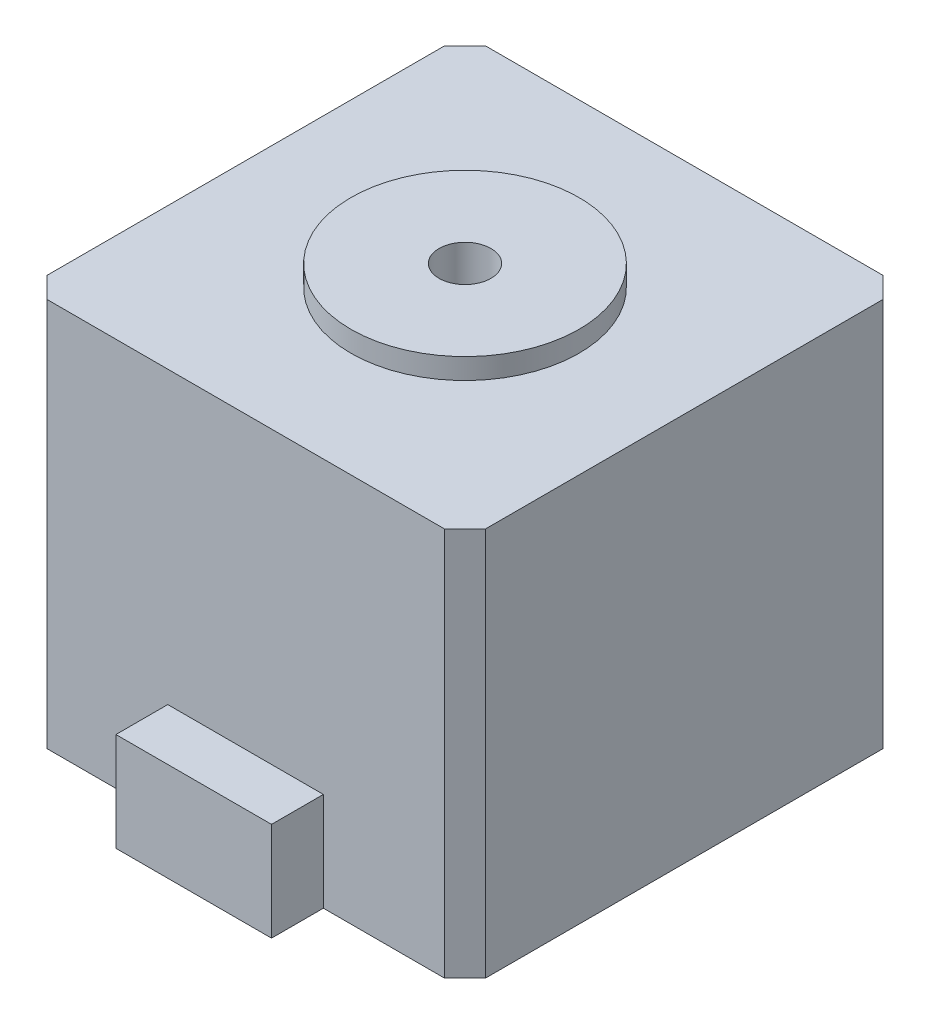
ISO-10303-21;
HEADER;
FILE_DESCRIPTION(('STEP AP214'),'2;1');
FILE_NAME('part.step','',(''),(''),'','','');
FILE_SCHEMA(('AUTOMOTIVE_DESIGN { 1 0 10303 214 1 1 1 1 }'));
ENDSEC;
DATA;
#1=APPLICATION_CONTEXT('core data for automotive mechanical design processes');
#2=APPLICATION_PROTOCOL_DEFINITION('international standard','automotive_design',2000,#1);
#3=PRODUCT_CONTEXT('',#1,'mechanical');
#4=PRODUCT('Part','Part','',(#3));
#5=PRODUCT_RELATED_PRODUCT_CATEGORY('part','',(#4));
#6=PRODUCT_DEFINITION_FORMATION('','',#4);
#7=PRODUCT_DEFINITION_CONTEXT('part definition',#1,'design');
#8=PRODUCT_DEFINITION('design','',#6,#7);
#9=PRODUCT_DEFINITION_SHAPE('','',#8);
#10=(LENGTH_UNIT() NAMED_UNIT(*) SI_UNIT(.MILLI.,.METRE.));
#11=(NAMED_UNIT(*) PLANE_ANGLE_UNIT() SI_UNIT($,.RADIAN.));
#12=(NAMED_UNIT(*) SI_UNIT($,.STERADIAN.) SOLID_ANGLE_UNIT());
#13=UNCERTAINTY_MEASURE_WITH_UNIT(LENGTH_MEASURE(1.E-05),#10,'distance_accuracy_value','');
#14=(GEOMETRIC_REPRESENTATION_CONTEXT(3) GLOBAL_UNCERTAINTY_ASSIGNED_CONTEXT((#13)) GLOBAL_UNIT_ASSIGNED_CONTEXT((#10,
#11,#12)) REPRESENTATION_CONTEXT('',''));
#15=CARTESIAN_POINT('',(0.,0.,0.));
#16=DIRECTION('',(0.,0.,1.));
#17=DIRECTION('',(1.,0.,0.));
#18=AXIS2_PLACEMENT_3D('',#15,#16,#17);
#19=CARTESIAN_POINT('',(0.,37.5,0.));
#20=DIRECTION('',(0.,0.,-1.));
#21=DIRECTION('',(-1.,0.,0.));
#22=AXIS2_PLACEMENT_3D('',#19,#20,#21);
#23=PLANE('',#22);
#24=DIRECTION('',(0.,-1.,0.));
#25=VECTOR('',#24,1.);
#26=CARTESIAN_POINT('',(13.65,0.,0.));
#27=LINE('',#26,#25);
#28=CARTESIAN_POINT('',(13.65,9.5,0.));
#29=VERTEX_POINT('',#28);
#30=CARTESIAN_POINT('',(13.65,0.,0.));
#31=VERTEX_POINT('',#30);
#32=EDGE_CURVE('E65',#29,#31,#27,.T.);
#33=ORIENTED_EDGE('',*,*,#32,.F.);
#34=DIRECTION('',(-1.,0.,0.));
#35=VECTOR('',#34,1.);
#36=CARTESIAN_POINT('',(13.65,9.5,0.));
#37=LINE('',#36,#35);
#38=CARTESIAN_POINT('',(28.65,9.5,0.));
#39=VERTEX_POINT('',#38);
#40=EDGE_CURVE('E161',#39,#29,#37,.T.);
#41=ORIENTED_EDGE('',*,*,#40,.F.);
#42=DIRECTION('',(0.,1.,0.));
#43=VECTOR('',#42,1.);
#44=CARTESIAN_POINT('',(28.65,0.,0.));
#45=LINE('',#44,#43);
#46=CARTESIAN_POINT('',(28.65,0.,0.));
#47=VERTEX_POINT('',#46);
#48=EDGE_CURVE('E71',#47,#39,#45,.T.);
#49=ORIENTED_EDGE('',*,*,#48,.F.);
#50=DIRECTION('',(1.,0.,0.));
#51=VECTOR('',#50,1.);
#52=CARTESIAN_POINT('',(0.,0.,0.));
#53=LINE('',#52,#51);
#54=CARTESIAN_POINT('',(40.3,0.,0.));
#55=VERTEX_POINT('',#54);
#56=EDGE_CURVE('E205',#47,#55,#53,.T.);
#57=ORIENTED_EDGE('',*,*,#56,.T.);
#58=DIRECTION('',(0.,1.,0.));
#59=VECTOR('',#58,1.);
#60=CARTESIAN_POINT('',(40.3,37.5,0.));
#61=LINE('',#60,#59);
#62=CARTESIAN_POINT('',(40.3,37.5,0.));
#63=VERTEX_POINT('',#62);
#64=EDGE_CURVE('E260',#55,#63,#61,.T.);
#65=ORIENTED_EDGE('',*,*,#64,.T.);
#66=DIRECTION('',(1.,0.,0.));
#67=VECTOR('',#66,1.);
#68=CARTESIAN_POINT('',(0.,37.5,0.));
#69=LINE('',#68,#67);
#70=CARTESIAN_POINT('',(2.,37.5,0.));
#71=VERTEX_POINT('',#70);
#72=EDGE_CURVE('E188',#71,#63,#69,.T.);
#73=ORIENTED_EDGE('',*,*,#72,.F.);
#74=DIRECTION('',(0.,-1.,0.));
#75=VECTOR('',#74,1.);
#76=CARTESIAN_POINT('',(2.,37.5,0.));
#77=LINE('',#76,#75);
#78=CARTESIAN_POINT('',(2.,0.,0.));
#79=VERTEX_POINT('',#78);
#80=EDGE_CURVE('E52',#71,#79,#77,.T.);
#81=ORIENTED_EDGE('',*,*,#80,.T.);
#82=EDGE_CURVE('E206',#79,#31,#53,.T.);
#83=ORIENTED_EDGE('',*,*,#82,.T.);
#84=EDGE_LOOP('',(#33,#41,#49,#57,#65,#73,#81,#83));
#85=FACE_BOUND('',#84,.T.);
#86=ADVANCED_FACE('F47',(#85),#23,.F.);
#87=CARTESIAN_POINT('',(0.,37.5,0.));
#88=DIRECTION('',(1.,0.,0.));
#89=DIRECTION('',(0.,0.,-1.));
#90=AXIS2_PLACEMENT_3D('',#87,#88,#89);
#91=PLANE('',#90);
#92=DIRECTION('',(0.,0.,1.));
#93=VECTOR('',#92,1.);
#94=CARTESIAN_POINT('',(0.,37.5,0.));
#95=LINE('',#94,#93);
#96=CARTESIAN_POINT('',(0.,37.5,-40.3));
#97=VERTEX_POINT('',#96);
#98=CARTESIAN_POINT('',(0.,37.5,-2.));
#99=VERTEX_POINT('',#98);
#100=EDGE_CURVE('E184',#97,#99,#95,.T.);
#101=ORIENTED_EDGE('',*,*,#100,.F.);
#102=DIRECTION('',(0.,-1.,0.));
#103=VECTOR('',#102,1.);
#104=CARTESIAN_POINT('',(0.,37.5,-40.3));
#105=LINE('',#104,#103);
#106=CARTESIAN_POINT('',(0.,0.,-40.3));
#107=VERTEX_POINT('',#106);
#108=EDGE_CURVE('E257',#97,#107,#105,.T.);
#109=ORIENTED_EDGE('',*,*,#108,.T.);
#110=DIRECTION('',(0.,0.,1.));
#111=VECTOR('',#110,1.);
#112=CARTESIAN_POINT('',(0.,0.,0.));
#113=LINE('',#112,#111);
#114=CARTESIAN_POINT('',(0.,0.,-2.));
#115=VERTEX_POINT('',#114);
#116=EDGE_CURVE('E182',#107,#115,#113,.T.);
#117=ORIENTED_EDGE('',*,*,#116,.T.);
#118=DIRECTION('',(0.,1.,0.));
#119=VECTOR('',#118,1.);
#120=CARTESIAN_POINT('',(0.,37.5,-2.));
#121=LINE('',#120,#119);
#122=EDGE_CURVE('E254',#115,#99,#121,.T.);
#123=ORIENTED_EDGE('',*,*,#122,.T.);
#124=EDGE_LOOP('',(#101,#109,#117,#123));
#125=FACE_BOUND('',#124,.T.);
#126=ADVANCED_FACE('F273',(#125),#91,.F.);
#127=CARTESIAN_POINT('',(42.3,37.5,0.));
#128=DIRECTION('',(-1.,0.,0.));
#129=DIRECTION('',(0.,0.,1.));
#130=AXIS2_PLACEMENT_3D('',#127,#128,#129);
#131=PLANE('',#130);
#132=DIRECTION('',(0.,0.,-1.));
#133=VECTOR('',#132,1.);
#134=CARTESIAN_POINT('',(42.3,0.,0.));
#135=LINE('',#134,#133);
#136=CARTESIAN_POINT('',(42.3,0.,-2.));
#137=VERTEX_POINT('',#136);
#138=CARTESIAN_POINT('',(42.3,0.,-40.3));
#139=VERTEX_POINT('',#138);
#140=EDGE_CURVE('E209',#137,#139,#135,.T.);
#141=ORIENTED_EDGE('',*,*,#140,.T.);
#142=DIRECTION('',(0.,1.,0.));
#143=VECTOR('',#142,1.);
#144=CARTESIAN_POINT('',(42.3,37.5,-40.3));
#145=LINE('',#144,#143);
#146=CARTESIAN_POINT('',(42.3,37.5,-40.3));
#147=VERTEX_POINT('',#146);
#148=EDGE_CURVE('E239',#139,#147,#145,.T.);
#149=ORIENTED_EDGE('',*,*,#148,.T.);
#150=DIRECTION('',(0.,0.,-1.));
#151=VECTOR('',#150,1.);
#152=CARTESIAN_POINT('',(42.3,37.5,0.));
#153=LINE('',#152,#151);
#154=CARTESIAN_POINT('',(42.3,37.5,-2.));
#155=VERTEX_POINT('',#154);
#156=EDGE_CURVE('E193',#155,#147,#153,.T.);
#157=ORIENTED_EDGE('',*,*,#156,.F.);
#158=DIRECTION('',(0.,-1.,0.));
#159=VECTOR('',#158,1.);
#160=CARTESIAN_POINT('',(42.3,37.5,-2.));
#161=LINE('',#160,#159);
#162=EDGE_CURVE('E235',#155,#137,#161,.T.);
#163=ORIENTED_EDGE('',*,*,#162,.T.);
#164=EDGE_LOOP('',(#141,#149,#157,#163));
#165=FACE_BOUND('',#164,.T.);
#166=ADVANCED_FACE('F293',(#165),#131,.F.);
#167=CARTESIAN_POINT('',(0.,37.5,-42.3));
#168=DIRECTION('',(0.,0.,1.));
#169=DIRECTION('',(1.,0.,0.));
#170=AXIS2_PLACEMENT_3D('',#167,#168,#169);
#171=PLANE('',#170);
#172=DIRECTION('',(-1.,0.,0.));
#173=VECTOR('',#172,1.);
#174=CARTESIAN_POINT('',(0.,37.5,-42.3));
#175=LINE('',#174,#173);
#176=CARTESIAN_POINT('',(40.3,37.5,-42.3));
#177=VERTEX_POINT('',#176);
#178=CARTESIAN_POINT('',(2.00000000000001,37.5,-42.3));
#179=VERTEX_POINT('',#178);
#180=EDGE_CURVE('E197',#177,#179,#175,.T.);
#181=ORIENTED_EDGE('',*,*,#180,.F.);
#182=DIRECTION('',(0.,-1.,0.));
#183=VECTOR('',#182,1.);
#184=CARTESIAN_POINT('',(40.3,37.5,-42.3));
#185=LINE('',#184,#183);
#186=CARTESIAN_POINT('',(40.3,0.,-42.3));
#187=VERTEX_POINT('',#186);
#188=EDGE_CURVE('E218',#177,#187,#185,.T.);
#189=ORIENTED_EDGE('',*,*,#188,.T.);
#190=DIRECTION('',(-1.,0.,0.));
#191=VECTOR('',#190,1.);
#192=CARTESIAN_POINT('',(0.,0.,-42.3));
#193=LINE('',#192,#191);
#194=CARTESIAN_POINT('',(2.00000000000001,0.,-42.3));
#195=VERTEX_POINT('',#194);
#196=EDGE_CURVE('E189',#187,#195,#193,.T.);
#197=ORIENTED_EDGE('',*,*,#196,.T.);
#198=DIRECTION('',(0.,1.,0.));
#199=VECTOR('',#198,1.);
#200=CARTESIAN_POINT('',(2.00000000000002,37.5,-42.3));
#201=LINE('',#200,#199);
#202=EDGE_CURVE('E201',#195,#179,#201,.T.);
#203=ORIENTED_EDGE('',*,*,#202,.T.);
#204=EDGE_LOOP('',(#181,#189,#197,#203));
#205=FACE_BOUND('',#204,.T.);
#206=ADVANCED_FACE('F285',(#205),#171,.F.);
#207=CARTESIAN_POINT('',(0.,37.5,0.));
#208=DIRECTION('',(0.,-1.,0.));
#209=DIRECTION('',(0.,0.,-1.));
#210=AXIS2_PLACEMENT_3D('',#207,#208,#209);
#211=PLANE('',#210);
#212=CARTESIAN_POINT('',(21.15,37.5,-21.15));
#213=DIRECTION('',(0.,1.,0.));
#214=DIRECTION('',(0.,0.,1.));
#215=AXIS2_PLACEMENT_3D('',#212,#213,#214);
#216=CIRCLE('',#215,11.);
#217=CARTESIAN_POINT('',(21.15,37.5,-10.15));
#218=VERTEX_POINT('',#217);
#219=EDGE_CURVE('E11',#218,#218,#216,.T.);
#220=ORIENTED_EDGE('',*,*,#219,.F.);
#221=EDGE_LOOP('',(#220));
#222=FACE_BOUND('',#221,.T.);
#223=ORIENTED_EDGE('',*,*,#156,.T.);
#224=DIRECTION('',(0.707106781186548,0.,0.707106781186548));
#225=VECTOR('',#224,1.);
#226=CARTESIAN_POINT('',(40.3,37.5,-42.3));
#227=LINE('',#226,#225);
#228=EDGE_CURVE('E251',#147,#177,#227,.F.);
#229=ORIENTED_EDGE('',*,*,#228,.T.);
#230=ORIENTED_EDGE('',*,*,#180,.T.);
#231=DIRECTION('',(0.707106781186548,0.,-0.707106781186548));
#232=VECTOR('',#231,1.);
#233=CARTESIAN_POINT('',(0.,37.5,-40.3));
#234=LINE('',#233,#232);
#235=EDGE_CURVE('E248',#179,#97,#234,.F.);
#236=ORIENTED_EDGE('',*,*,#235,.T.);
#237=ORIENTED_EDGE('',*,*,#100,.T.);
#238=DIRECTION('',(-0.707106781186548,0.,-0.707106781186548));
#239=VECTOR('',#238,1.);
#240=CARTESIAN_POINT('',(2.,37.5,0.));
#241=LINE('',#240,#239);
#242=EDGE_CURVE('E245',#99,#71,#241,.F.);
#243=ORIENTED_EDGE('',*,*,#242,.T.);
#244=ORIENTED_EDGE('',*,*,#72,.T.);
#245=DIRECTION('',(-0.707106781186548,0.,0.707106781186548));
#246=VECTOR('',#245,1.);
#247=CARTESIAN_POINT('',(42.3,37.5,-2.));
#248=LINE('',#247,#246);
#249=EDGE_CURVE('E242',#63,#155,#248,.F.);
#250=ORIENTED_EDGE('',*,*,#249,.T.);
#251=EDGE_LOOP('',(#223,#229,#230,#236,#237,#243,#244,#250));
#252=FACE_BOUND('',#251,.T.);
#253=ADVANCED_FACE('F277',(#222,#252),#211,.F.);
#254=CARTESIAN_POINT('',(0.,0.,0.));
#255=DIRECTION('',(0.,-1.,0.));
#256=DIRECTION('',(0.,0.,-1.));
#257=AXIS2_PLACEMENT_3D('',#254,#255,#256);
#258=PLANE('',#257);
#259=ORIENTED_EDGE('',*,*,#196,.F.);
#260=DIRECTION('',(-0.707106781186548,0.,-0.707106781186548));
#261=VECTOR('',#260,1.);
#262=CARTESIAN_POINT('',(41.3,0.,-41.3));
#263=LINE('',#262,#261);
#264=EDGE_CURVE('E232',#187,#139,#263,.F.);
#265=ORIENTED_EDGE('',*,*,#264,.T.);
#266=ORIENTED_EDGE('',*,*,#140,.F.);
#267=DIRECTION('',(0.707106781186548,0.,-0.707106781186548));
#268=VECTOR('',#267,1.);
#269=CARTESIAN_POINT('',(20.15,0.,20.15));
#270=LINE('',#269,#268);
#271=EDGE_CURVE('E222',#137,#55,#270,.F.);
#272=ORIENTED_EDGE('',*,*,#271,.T.);
#273=ORIENTED_EDGE('',*,*,#56,.F.);
#274=DIRECTION('',(0.,0.,-1.));
#275=VECTOR('',#274,1.);
#276=CARTESIAN_POINT('',(28.65,0.,5.));
#277=LINE('',#276,#275);
#278=CARTESIAN_POINT('',(28.65,0.,5.));
#279=VERTEX_POINT('',#278);
#280=EDGE_CURVE('E146',#279,#47,#277,.T.);
#281=ORIENTED_EDGE('',*,*,#280,.F.);
#282=DIRECTION('',(1.,0.,0.));
#283=VECTOR('',#282,1.);
#284=CARTESIAN_POINT('',(13.65,0.,5.));
#285=LINE('',#284,#283);
#286=CARTESIAN_POINT('',(13.65,0.,5.));
#287=VERTEX_POINT('',#286);
#288=EDGE_CURVE('E138',#287,#279,#285,.T.);
#289=ORIENTED_EDGE('',*,*,#288,.F.);
#290=DIRECTION('',(0.,0.,-1.));
#291=VECTOR('',#290,1.);
#292=CARTESIAN_POINT('',(13.65,0.,5.));
#293=LINE('',#292,#291);
#294=EDGE_CURVE('E144',#287,#31,#293,.T.);
#295=ORIENTED_EDGE('',*,*,#294,.T.);
#296=ORIENTED_EDGE('',*,*,#82,.F.);
#297=DIRECTION('',(0.707106781186548,0.,0.707106781186548));
#298=VECTOR('',#297,1.);
#299=CARTESIAN_POINT('',(1.,0.,-1.));
#300=LINE('',#299,#298);
#301=EDGE_CURVE('E226',#79,#115,#300,.F.);
#302=ORIENTED_EDGE('',*,*,#301,.T.);
#303=ORIENTED_EDGE('',*,*,#116,.F.);
#304=DIRECTION('',(-0.707106781186548,0.,0.707106781186548));
#305=VECTOR('',#304,1.);
#306=CARTESIAN_POINT('',(-20.15,0.,-20.15));
#307=LINE('',#306,#305);
#308=EDGE_CURVE('E229',#107,#195,#307,.F.);
#309=ORIENTED_EDGE('',*,*,#308,.T.);
#310=EDGE_LOOP('',(#259,#265,#266,#272,#273,#281,#289,#295,#296,#302,#303,#309));
#311=FACE_BOUND('',#310,.T.);
#312=ADVANCED_FACE('F141',(#311),#258,.T.);
#313=CARTESIAN_POINT('',(40.3,37.5,-42.3));
#314=DIRECTION('',(-0.707106781186547,0.,0.707106781186547));
#315=DIRECTION('',(0.,-1.,0.));
#316=AXIS2_PLACEMENT_3D('',#313,#314,#315);
#317=PLANE('',#316);
#318=ORIENTED_EDGE('',*,*,#228,.F.);
#319=ORIENTED_EDGE('',*,*,#148,.F.);
#320=ORIENTED_EDGE('',*,*,#264,.F.);
#321=ORIENTED_EDGE('',*,*,#188,.F.);
#322=EDGE_LOOP('',(#318,#319,#320,#321));
#323=FACE_BOUND('',#322,.T.);
#324=ADVANCED_FACE('F289',(#323),#317,.F.);
#325=CARTESIAN_POINT('',(0.,37.5,-40.3));
#326=DIRECTION('',(0.707106781186547,0.,0.707106781186547));
#327=DIRECTION('',(0.,-1.,0.));
#328=AXIS2_PLACEMENT_3D('',#325,#326,#327);
#329=PLANE('',#328);
#330=ORIENTED_EDGE('',*,*,#235,.F.);
#331=ORIENTED_EDGE('',*,*,#202,.F.);
#332=ORIENTED_EDGE('',*,*,#308,.F.);
#333=ORIENTED_EDGE('',*,*,#108,.F.);
#334=EDGE_LOOP('',(#330,#331,#332,#333));
#335=FACE_BOUND('',#334,.T.);
#336=ADVANCED_FACE('F281',(#335),#329,.F.);
#337=CARTESIAN_POINT('',(2.,37.5,0.));
#338=DIRECTION('',(0.707106781186547,0.,-0.707106781186547));
#339=DIRECTION('',(0.,-1.,0.));
#340=AXIS2_PLACEMENT_3D('',#337,#338,#339);
#341=PLANE('',#340);
#342=ORIENTED_EDGE('',*,*,#242,.F.);
#343=ORIENTED_EDGE('',*,*,#122,.F.);
#344=ORIENTED_EDGE('',*,*,#301,.F.);
#345=ORIENTED_EDGE('',*,*,#80,.F.);
#346=EDGE_LOOP('',(#342,#343,#344,#345));
#347=FACE_BOUND('',#346,.T.);
#348=ADVANCED_FACE('F275',(#347),#341,.F.);
#349=CARTESIAN_POINT('',(42.3,37.5,-2.));
#350=DIRECTION('',(-0.707106781186547,0.,-0.707106781186547));
#351=DIRECTION('',(0.,-1.,0.));
#352=AXIS2_PLACEMENT_3D('',#349,#350,#351);
#353=PLANE('',#352);
#354=ORIENTED_EDGE('',*,*,#249,.F.);
#355=ORIENTED_EDGE('',*,*,#64,.F.);
#356=ORIENTED_EDGE('',*,*,#271,.F.);
#357=ORIENTED_EDGE('',*,*,#162,.F.);
#358=EDGE_LOOP('',(#354,#355,#356,#357));
#359=FACE_BOUND('',#358,.T.);
#360=ADVANCED_FACE('F50',(#359),#353,.F.);
#361=CARTESIAN_POINT('',(21.15,39.5,-21.15));
#362=DIRECTION('',(0.,-1.,0.));
#363=DIRECTION('',(0.,0.,-1.));
#364=AXIS2_PLACEMENT_3D('',#361,#362,#363);
#365=CYLINDRICAL_SURFACE('',#364,11.);
#366=CARTESIAN_POINT('',(21.15,39.5,-21.15));
#367=DIRECTION('',(0.,1.,0.));
#368=DIRECTION('',(0.,0.,1.));
#369=AXIS2_PLACEMENT_3D('',#366,#367,#368);
#370=CIRCLE('',#369,11.);
#371=CARTESIAN_POINT('',(21.15,39.5,-10.15));
#372=VERTEX_POINT('',#371);
#373=EDGE_CURVE('E178',#372,#372,#370,.T.);
#374=ORIENTED_EDGE('',*,*,#373,.F.);
#375=EDGE_LOOP('',(#374));
#376=FACE_BOUND('',#375,.T.);
#377=ORIENTED_EDGE('',*,*,#219,.T.);
#378=EDGE_LOOP('',(#377));
#379=FACE_BOUND('',#378,.T.);
#380=ADVANCED_FACE('F353',(#376,#379),#365,.T.);
#381=CARTESIAN_POINT('',(21.15,39.5,-21.15));
#382=DIRECTION('',(0.,1.,0.));
#383=DIRECTION('',(0.,0.,1.));
#384=AXIS2_PLACEMENT_3D('',#381,#382,#383);
#385=PLANE('',#384);
#386=CARTESIAN_POINT('',(21.15,39.5,-21.15));
#387=DIRECTION('',(0.,1.,0.));
#388=DIRECTION('',(0.,0.,1.));
#389=AXIS2_PLACEMENT_3D('',#386,#387,#388);
#390=CIRCLE('',#389,2.5);
#391=CARTESIAN_POINT('',(21.15,39.5,-18.65));
#392=VERTEX_POINT('',#391);
#393=EDGE_CURVE('E165',#392,#392,#390,.T.);
#394=ORIENTED_EDGE('',*,*,#393,.F.);
#395=EDGE_LOOP('',(#394));
#396=FACE_BOUND('',#395,.T.);
#397=ORIENTED_EDGE('',*,*,#373,.T.);
#398=EDGE_LOOP('',(#397));
#399=FACE_BOUND('',#398,.T.);
#400=ADVANCED_FACE('F358',(#396,#399),#385,.T.);
#401=CARTESIAN_POINT('',(21.15,19.5,-21.15));
#402=DIRECTION('',(0.,1.,0.));
#403=DIRECTION('',(0.,0.,1.));
#404=AXIS2_PLACEMENT_3D('',#401,#402,#403);
#405=CYLINDRICAL_SURFACE('',#404,2.5);
#406=CARTESIAN_POINT('',(21.15,19.5,-21.15));
#407=DIRECTION('',(0.,1.,0.));
#408=DIRECTION('',(0.,0.,1.));
#409=AXIS2_PLACEMENT_3D('',#406,#407,#408);
#410=CIRCLE('',#409,2.5);
#411=CARTESIAN_POINT('',(21.15,19.5,-18.65));
#412=VERTEX_POINT('',#411);
#413=EDGE_CURVE('E170',#412,#412,#410,.T.);
#414=ORIENTED_EDGE('',*,*,#413,.F.);
#415=EDGE_LOOP('',(#414));
#416=FACE_BOUND('',#415,.T.);
#417=ORIENTED_EDGE('',*,*,#393,.T.);
#418=EDGE_LOOP('',(#417));
#419=FACE_BOUND('',#418,.T.);
#420=ADVANCED_FACE('F364',(#416,#419),#405,.F.);
#421=CARTESIAN_POINT('',(21.15,19.5,-21.15));
#422=DIRECTION('',(0.,1.,0.));
#423=DIRECTION('',(0.,0.,1.));
#424=AXIS2_PLACEMENT_3D('',#421,#422,#423);
#425=PLANE('',#424);
#426=ORIENTED_EDGE('',*,*,#413,.T.);
#427=EDGE_LOOP('',(#426));
#428=FACE_BOUND('',#427,.T.);
#429=ADVANCED_FACE('F436',(#428),#425,.T.);
#430=CARTESIAN_POINT('',(13.65,0.,5.));
#431=DIRECTION('',(1.,0.,0.));
#432=DIRECTION('',(0.,0.,-1.));
#433=AXIS2_PLACEMENT_3D('',#430,#431,#432);
#434=PLANE('',#433);
#435=ORIENTED_EDGE('',*,*,#32,.T.);
#436=ORIENTED_EDGE('',*,*,#294,.F.);
#437=DIRECTION('',(0.,-1.,0.));
#438=VECTOR('',#437,1.);
#439=CARTESIAN_POINT('',(13.65,0.,5.));
#440=LINE('',#439,#438);
#441=CARTESIAN_POINT('',(13.65,9.5,5.));
#442=VERTEX_POINT('',#441);
#443=EDGE_CURVE('E151',#442,#287,#440,.T.);
#444=ORIENTED_EDGE('',*,*,#443,.F.);
#445=DIRECTION('',(0.,0.,-1.));
#446=VECTOR('',#445,1.);
#447=CARTESIAN_POINT('',(13.65,9.5,5.));
#448=LINE('',#447,#446);
#449=EDGE_CURVE('E305',#442,#29,#448,.T.);
#450=ORIENTED_EDGE('',*,*,#449,.T.);
#451=EDGE_LOOP('',(#435,#436,#444,#450));
#452=FACE_BOUND('',#451,.T.);
#453=ADVANCED_FACE('F163',(#452),#434,.F.);
#454=CARTESIAN_POINT('',(28.65,0.,5.));
#455=DIRECTION('',(-1.,0.,0.));
#456=DIRECTION('',(0.,0.,1.));
#457=AXIS2_PLACEMENT_3D('',#454,#455,#456);
#458=PLANE('',#457);
#459=ORIENTED_EDGE('',*,*,#48,.T.);
#460=DIRECTION('',(0.,0.,-1.));
#461=VECTOR('',#460,1.);
#462=CARTESIAN_POINT('',(28.65,9.5,5.));
#463=LINE('',#462,#461);
#464=CARTESIAN_POINT('',(28.65,9.5,5.));
#465=VERTEX_POINT('',#464);
#466=EDGE_CURVE('E172',#465,#39,#463,.T.);
#467=ORIENTED_EDGE('',*,*,#466,.F.);
#468=DIRECTION('',(0.,1.,0.));
#469=VECTOR('',#468,1.);
#470=CARTESIAN_POINT('',(28.65,0.,5.));
#471=LINE('',#470,#469);
#472=EDGE_CURVE('E150',#279,#465,#471,.T.);
#473=ORIENTED_EDGE('',*,*,#472,.F.);
#474=ORIENTED_EDGE('',*,*,#280,.T.);
#475=EDGE_LOOP('',(#459,#467,#473,#474));
#476=FACE_BOUND('',#475,.T.);
#477=ADVANCED_FACE('F299',(#476),#458,.F.);
#478=CARTESIAN_POINT('',(13.65,9.5,5.));
#479=DIRECTION('',(0.,-1.,0.));
#480=DIRECTION('',(0.,0.,-1.));
#481=AXIS2_PLACEMENT_3D('',#478,#479,#480);
#482=PLANE('',#481);
#483=ORIENTED_EDGE('',*,*,#40,.T.);
#484=ORIENTED_EDGE('',*,*,#449,.F.);
#485=DIRECTION('',(-1.,0.,0.));
#486=VECTOR('',#485,1.);
#487=CARTESIAN_POINT('',(13.65,9.5,5.));
#488=LINE('',#487,#486);
#489=EDGE_CURVE('E156',#465,#442,#488,.T.);
#490=ORIENTED_EDGE('',*,*,#489,.F.);
#491=ORIENTED_EDGE('',*,*,#466,.T.);
#492=EDGE_LOOP('',(#483,#484,#490,#491));
#493=FACE_BOUND('',#492,.T.);
#494=ADVANCED_FACE('F317',(#493),#482,.F.);
#495=CARTESIAN_POINT('',(0.,0.,5.));
#496=DIRECTION('',(0.,0.,-1.));
#497=DIRECTION('',(-1.,0.,0.));
#498=AXIS2_PLACEMENT_3D('',#495,#496,#497);
#499=PLANE('',#498);
#500=ORIENTED_EDGE('',*,*,#443,.T.);
#501=ORIENTED_EDGE('',*,*,#288,.T.);
#502=ORIENTED_EDGE('',*,*,#472,.T.);
#503=ORIENTED_EDGE('',*,*,#489,.T.);
#504=EDGE_LOOP('',(#500,#501,#502,#503));
#505=FACE_BOUND('',#504,.T.);
#506=ADVANCED_FACE('F154',(#505),#499,.F.);
#507=CLOSED_SHELL('',(#86,#126,#166,#206,#253,#312,#324,#336,#348,#360,#380,#400,#420,#429,#453,
#477,#494,#506));
#508=MANIFOLD_SOLID_BREP('B2',#507);
#509=ADVANCED_BREP_SHAPE_REPRESENTATION('',(#18,#508),#14);
#510=SHAPE_DEFINITION_REPRESENTATION(#9,#509);
ENDSEC;
END-ISO-10303-21;
